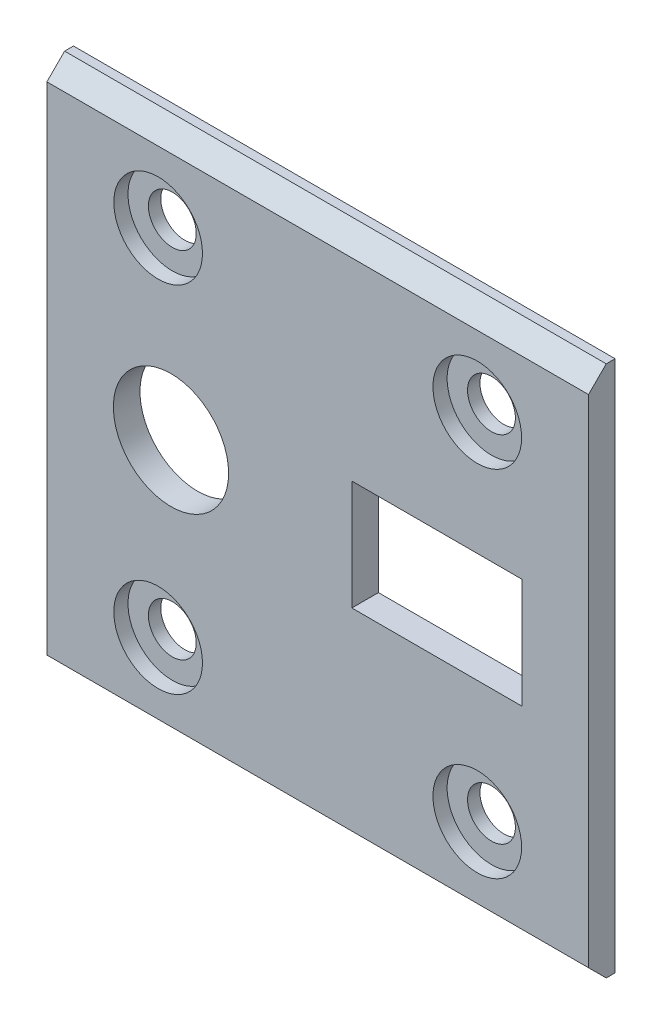
ISO-10303-21;
HEADER;
FILE_DESCRIPTION(('STEP AP214'),'2;1');
FILE_NAME('part.step','',(''),(''),'','','');
FILE_SCHEMA(('AUTOMOTIVE_DESIGN { 1 0 10303 214 1 1 1 1 }'));
ENDSEC;
DATA;
#1=APPLICATION_CONTEXT('core data for automotive mechanical design processes');
#2=APPLICATION_PROTOCOL_DEFINITION('international standard','automotive_design',2000,#1);
#3=PRODUCT_CONTEXT('',#1,'mechanical');
#4=PRODUCT('Part','Part','',(#3));
#5=PRODUCT_RELATED_PRODUCT_CATEGORY('part','',(#4));
#6=PRODUCT_DEFINITION_FORMATION('','',#4);
#7=PRODUCT_DEFINITION_CONTEXT('part definition',#1,'design');
#8=PRODUCT_DEFINITION('design','',#6,#7);
#9=PRODUCT_DEFINITION_SHAPE('','',#8);
#10=(LENGTH_UNIT() NAMED_UNIT(*) SI_UNIT(.MILLI.,.METRE.));
#11=(NAMED_UNIT(*) PLANE_ANGLE_UNIT() SI_UNIT($,.RADIAN.));
#12=(NAMED_UNIT(*) SI_UNIT($,.STERADIAN.) SOLID_ANGLE_UNIT());
#13=UNCERTAINTY_MEASURE_WITH_UNIT(LENGTH_MEASURE(1.E-05),#10,'distance_accuracy_value','');
#14=(GEOMETRIC_REPRESENTATION_CONTEXT(3) GLOBAL_UNCERTAINTY_ASSIGNED_CONTEXT((#13)) GLOBAL_UNIT_ASSIGNED_CONTEXT((#10,
#11,#12)) REPRESENTATION_CONTEXT('',''));
#15=CARTESIAN_POINT('',(0.,0.,0.));
#16=DIRECTION('',(0.,0.,1.));
#17=DIRECTION('',(1.,0.,0.));
#18=AXIS2_PLACEMENT_3D('',#15,#16,#17);
#19=CARTESIAN_POINT('',(18.,-20.,0.));
#20=DIRECTION('',(0.,0.,1.));
#21=DIRECTION('',(1.,0.,0.));
#22=AXIS2_PLACEMENT_3D('',#19,#20,#21);
#23=CYLINDRICAL_SURFACE('',#22,2.7);
#24=CARTESIAN_POINT('',(18.,-20.,0.));
#25=DIRECTION('',(0.,0.,-1.));
#26=DIRECTION('',(1.,0.,0.));
#27=AXIS2_PLACEMENT_3D('',#24,#25,#26);
#28=CIRCLE('',#27,2.7);
#29=CARTESIAN_POINT('',(20.7,-20.,0.));
#30=VERTEX_POINT('',#29);
#31=EDGE_CURVE('E214',#30,#30,#28,.T.);
#32=ORIENTED_EDGE('',*,*,#31,.T.);
#33=EDGE_LOOP('',(#32));
#34=FACE_BOUND('',#33,.T.);
#35=CARTESIAN_POINT('',(18.,-20.,1.4));
#36=DIRECTION('',(0.,0.,1.));
#37=DIRECTION('',(1.,0.,0.));
#38=AXIS2_PLACEMENT_3D('',#35,#36,#37);
#39=CIRCLE('',#38,2.7);
#40=CARTESIAN_POINT('',(20.7,-20.,1.4));
#41=VERTEX_POINT('',#40);
#42=EDGE_CURVE('E216',#41,#41,#39,.T.);
#43=ORIENTED_EDGE('',*,*,#42,.T.);
#44=EDGE_LOOP('',(#43));
#45=FACE_BOUND('',#44,.T.);
#46=ADVANCED_FACE('F33',(#34,#45),#23,.F.);
#47=CARTESIAN_POINT('',(-18.,-20.,0.));
#48=DIRECTION('',(0.,0.,1.));
#49=DIRECTION('',(1.,0.,0.));
#50=AXIS2_PLACEMENT_3D('',#47,#48,#49);
#51=CYLINDRICAL_SURFACE('',#50,2.7);
#52=CARTESIAN_POINT('',(-18.,-20.,0.));
#53=DIRECTION('',(0.,0.,-1.));
#54=DIRECTION('',(1.,0.,0.));
#55=AXIS2_PLACEMENT_3D('',#52,#53,#54);
#56=CIRCLE('',#55,2.7);
#57=CARTESIAN_POINT('',(-15.3,-20.,0.));
#58=VERTEX_POINT('',#57);
#59=EDGE_CURVE('E130',#58,#58,#56,.T.);
#60=ORIENTED_EDGE('',*,*,#59,.T.);
#61=EDGE_LOOP('',(#60));
#62=FACE_BOUND('',#61,.T.);
#63=CARTESIAN_POINT('',(-18.,-20.,1.4));
#64=DIRECTION('',(0.,0.,1.));
#65=DIRECTION('',(1.,0.,0.));
#66=AXIS2_PLACEMENT_3D('',#63,#64,#65);
#67=CIRCLE('',#66,2.7);
#68=CARTESIAN_POINT('',(-15.3,-20.,1.4));
#69=VERTEX_POINT('',#68);
#70=EDGE_CURVE('E211',#69,#69,#67,.T.);
#71=ORIENTED_EDGE('',*,*,#70,.T.);
#72=EDGE_LOOP('',(#71));
#73=FACE_BOUND('',#72,.T.);
#74=ADVANCED_FACE('F259',(#62,#73),#51,.F.);
#75=CARTESIAN_POINT('',(18.,20.,0.));
#76=DIRECTION('',(0.,0.,1.));
#77=DIRECTION('',(1.,0.,0.));
#78=AXIS2_PLACEMENT_3D('',#75,#76,#77);
#79=CYLINDRICAL_SURFACE('',#78,2.7);
#80=CARTESIAN_POINT('',(18.,20.,0.));
#81=DIRECTION('',(0.,0.,1.));
#82=DIRECTION('',(1.,0.,0.));
#83=AXIS2_PLACEMENT_3D('',#80,#81,#82);
#84=CIRCLE('',#83,2.7);
#85=CARTESIAN_POINT('',(20.7,20.,0.));
#86=VERTEX_POINT('',#85);
#87=EDGE_CURVE('E154',#86,#86,#84,.T.);
#88=ORIENTED_EDGE('',*,*,#87,.F.);
#89=EDGE_LOOP('',(#88));
#90=FACE_BOUND('',#89,.T.);
#91=CARTESIAN_POINT('',(18.,20.,1.4));
#92=DIRECTION('',(0.,0.,1.));
#93=DIRECTION('',(1.,0.,0.));
#94=AXIS2_PLACEMENT_3D('',#91,#92,#93);
#95=CIRCLE('',#94,2.7);
#96=CARTESIAN_POINT('',(20.7,20.,1.4));
#97=VERTEX_POINT('',#96);
#98=EDGE_CURVE('E144',#97,#97,#95,.F.);
#99=ORIENTED_EDGE('',*,*,#98,.F.);
#100=EDGE_LOOP('',(#99));
#101=FACE_BOUND('',#100,.T.);
#102=ADVANCED_FACE('F265',(#90,#101),#79,.F.);
#103=CARTESIAN_POINT('',(-18.,20.,0.));
#104=DIRECTION('',(0.,0.,1.));
#105=DIRECTION('',(1.,0.,0.));
#106=AXIS2_PLACEMENT_3D('',#103,#104,#105);
#107=CYLINDRICAL_SURFACE('',#106,2.7);
#108=CARTESIAN_POINT('',(-18.,20.,0.));
#109=DIRECTION('',(0.,0.,1.));
#110=DIRECTION('',(1.,0.,0.));
#111=AXIS2_PLACEMENT_3D('',#108,#109,#110);
#112=CIRCLE('',#111,2.7);
#113=CARTESIAN_POINT('',(-15.3,20.,0.));
#114=VERTEX_POINT('',#113);
#115=EDGE_CURVE('E157',#114,#114,#112,.T.);
#116=ORIENTED_EDGE('',*,*,#115,.F.);
#117=EDGE_LOOP('',(#116));
#118=FACE_BOUND('',#117,.T.);
#119=CARTESIAN_POINT('',(-18.,20.,1.4));
#120=DIRECTION('',(0.,0.,1.));
#121=DIRECTION('',(1.,0.,0.));
#122=AXIS2_PLACEMENT_3D('',#119,#120,#121);
#123=CIRCLE('',#122,2.7);
#124=CARTESIAN_POINT('',(-15.3,20.,1.4));
#125=VERTEX_POINT('',#124);
#126=EDGE_CURVE('E150',#125,#125,#123,.F.);
#127=ORIENTED_EDGE('',*,*,#126,.F.);
#128=EDGE_LOOP('',(#127));
#129=FACE_BOUND('',#128,.T.);
#130=ADVANCED_FACE('F288',(#118,#129),#107,.F.);
#131=CARTESIAN_POINT('',(0.,0.,3.));
#132=DIRECTION('',(0.,0.,1.));
#133=DIRECTION('',(1.,0.,0.));
#134=AXIS2_PLACEMENT_3D('',#131,#132,#133);
#135=PLANE('',#134);
#136=CARTESIAN_POINT('',(18.,-20.,3.));
#137=DIRECTION('',(0.,0.,-1.));
#138=DIRECTION('',(1.,0.,0.));
#139=AXIS2_PLACEMENT_3D('',#136,#137,#138);
#140=CIRCLE('',#139,5.);
#141=CARTESIAN_POINT('',(23.,-20.,3.));
#142=VERTEX_POINT('',#141);
#143=EDGE_CURVE('E355',#142,#142,#140,.T.);
#144=ORIENTED_EDGE('',*,*,#143,.T.);
#145=EDGE_LOOP('',(#144));
#146=FACE_BOUND('',#145,.T.);
#147=CARTESIAN_POINT('',(-18.,-20.,3.));
#148=DIRECTION('',(0.,0.,-1.));
#149=DIRECTION('',(1.,0.,0.));
#150=AXIS2_PLACEMENT_3D('',#147,#148,#149);
#151=CIRCLE('',#150,5.);
#152=CARTESIAN_POINT('',(-13.,-20.,3.));
#153=VERTEX_POINT('',#152);
#154=EDGE_CURVE('E219',#153,#153,#151,.T.);
#155=ORIENTED_EDGE('',*,*,#154,.T.);
#156=EDGE_LOOP('',(#155));
#157=FACE_BOUND('',#156,.T.);
#158=CARTESIAN_POINT('',(18.,20.,3.));
#159=DIRECTION('',(0.,0.,1.));
#160=DIRECTION('',(1.,0.,0.));
#161=AXIS2_PLACEMENT_3D('',#158,#159,#160);
#162=CIRCLE('',#161,5.);
#163=CARTESIAN_POINT('',(23.,20.,3.));
#164=VERTEX_POINT('',#163);
#165=EDGE_CURVE('E138',#164,#164,#162,.T.);
#166=ORIENTED_EDGE('',*,*,#165,.F.);
#167=EDGE_LOOP('',(#166));
#168=FACE_BOUND('',#167,.T.);
#169=CARTESIAN_POINT('',(-18.,20.,3.));
#170=DIRECTION('',(0.,0.,1.));
#171=DIRECTION('',(1.,0.,0.));
#172=AXIS2_PLACEMENT_3D('',#169,#170,#171);
#173=CIRCLE('',#172,5.);
#174=CARTESIAN_POINT('',(-13.,20.,3.));
#175=VERTEX_POINT('',#174);
#176=EDGE_CURVE('E151',#175,#175,#173,.T.);
#177=ORIENTED_EDGE('',*,*,#176,.F.);
#178=EDGE_LOOP('',(#177));
#179=FACE_BOUND('',#178,.T.);
#180=DIRECTION('',(0.,-1.,0.));
#181=VECTOR('',#180,1.);
#182=CARTESIAN_POINT('',(-30.55,10.,3.));
#183=LINE('',#182,#181);
#184=CARTESIAN_POINT('',(-30.55,28.,3.));
#185=VERTEX_POINT('',#184);
#186=CARTESIAN_POINT('',(-30.55,-28.,3.));
#187=VERTEX_POINT('',#186);
#188=EDGE_CURVE('E203',#185,#187,#183,.T.);
#189=ORIENTED_EDGE('',*,*,#188,.T.);
#190=DIRECTION('',(1.,0.,0.));
#191=VECTOR('',#190,1.);
#192=CARTESIAN_POINT('',(30.55,-28.,3.));
#193=LINE('',#192,#191);
#194=CARTESIAN_POINT('',(30.55,-28.,3.));
#195=VERTEX_POINT('',#194);
#196=EDGE_CURVE('E229',#187,#195,#193,.T.);
#197=ORIENTED_EDGE('',*,*,#196,.T.);
#198=DIRECTION('',(0.,1.,0.));
#199=VECTOR('',#198,1.);
#200=CARTESIAN_POINT('',(30.55,10.,3.));
#201=LINE('',#200,#199);
#202=CARTESIAN_POINT('',(30.55,28.,3.));
#203=VERTEX_POINT('',#202);
#204=EDGE_CURVE('E120',#195,#203,#201,.T.);
#205=ORIENTED_EDGE('',*,*,#204,.T.);
#206=DIRECTION('',(-1.,0.,0.));
#207=VECTOR('',#206,1.);
#208=CARTESIAN_POINT('',(0.,28.,3.));
#209=LINE('',#208,#207);
#210=EDGE_CURVE('E226',#203,#185,#209,.T.);
#211=ORIENTED_EDGE('',*,*,#210,.T.);
#212=EDGE_LOOP('',(#189,#197,#205,#211));
#213=FACE_BOUND('',#212,.T.);
#214=CARTESIAN_POINT('',(-16.55,0.,3.));
#215=DIRECTION('',(0.,0.,1.));
#216=DIRECTION('',(1.,0.,0.));
#217=AXIS2_PLACEMENT_3D('',#214,#215,#216);
#218=CIRCLE('',#217,6.5);
#219=CARTESIAN_POINT('',(-10.05,0.,3.));
#220=VERTEX_POINT('',#219);
#221=EDGE_CURVE('E197',#220,#220,#218,.T.);
#222=ORIENTED_EDGE('',*,*,#221,.F.);
#223=EDGE_LOOP('',(#222));
#224=FACE_BOUND('',#223,.T.);
#225=DIRECTION('',(-1.,0.,0.));
#226=VECTOR('',#225,1.);
#227=CARTESIAN_POINT('',(3.85000000000001,6.2,3.));
#228=LINE('',#227,#226);
#229=CARTESIAN_POINT('',(23.05,6.2,3.));
#230=VERTEX_POINT('',#229);
#231=CARTESIAN_POINT('',(3.85000000000001,6.2,3.));
#232=VERTEX_POINT('',#231);
#233=EDGE_CURVE('E168',#230,#232,#228,.T.);
#234=ORIENTED_EDGE('',*,*,#233,.F.);
#235=DIRECTION('',(0.,1.,0.));
#236=VECTOR('',#235,1.);
#237=CARTESIAN_POINT('',(23.05,6.2,3.));
#238=LINE('',#237,#236);
#239=CARTESIAN_POINT('',(23.05,-6.2,3.));
#240=VERTEX_POINT('',#239);
#241=EDGE_CURVE('E166',#240,#230,#238,.T.);
#242=ORIENTED_EDGE('',*,*,#241,.F.);
#243=DIRECTION('',(1.,0.,0.));
#244=VECTOR('',#243,1.);
#245=CARTESIAN_POINT('',(3.85000000000001,-6.2,3.));
#246=LINE('',#245,#244);
#247=CARTESIAN_POINT('',(3.85000000000001,-6.2,3.));
#248=VERTEX_POINT('',#247);
#249=EDGE_CURVE('E174',#248,#240,#246,.T.);
#250=ORIENTED_EDGE('',*,*,#249,.F.);
#251=DIRECTION('',(0.,-1.,0.));
#252=VECTOR('',#251,1.);
#253=CARTESIAN_POINT('',(3.85000000000001,6.2,3.));
#254=LINE('',#253,#252);
#255=EDGE_CURVE('E171',#232,#248,#254,.T.);
#256=ORIENTED_EDGE('',*,*,#255,.F.);
#257=EDGE_LOOP('',(#234,#242,#250,#256));
#258=FACE_BOUND('',#257,.T.);
#259=ADVANCED_FACE('F238',(#146,#157,#168,#179,#213,#224,#258),#135,.T.);
#260=CARTESIAN_POINT('',(0.,0.,0.));
#261=DIRECTION('',(0.,0.,1.));
#262=DIRECTION('',(1.,0.,0.));
#263=AXIS2_PLACEMENT_3D('',#260,#261,#262);
#264=PLANE('',#263);
#265=ORIENTED_EDGE('',*,*,#31,.F.);
#266=EDGE_LOOP('',(#265));
#267=FACE_BOUND('',#266,.T.);
#268=ORIENTED_EDGE('',*,*,#59,.F.);
#269=EDGE_LOOP('',(#268));
#270=FACE_BOUND('',#269,.T.);
#271=ORIENTED_EDGE('',*,*,#87,.T.);
#272=EDGE_LOOP('',(#271));
#273=FACE_BOUND('',#272,.T.);
#274=ORIENTED_EDGE('',*,*,#115,.T.);
#275=EDGE_LOOP('',(#274));
#276=FACE_BOUND('',#275,.T.);
#277=CARTESIAN_POINT('',(-16.55,0.,0.));
#278=DIRECTION('',(0.,0.,1.));
#279=DIRECTION('',(1.,0.,0.));
#280=AXIS2_PLACEMENT_3D('',#277,#278,#279);
#281=CIRCLE('',#280,6.5);
#282=CARTESIAN_POINT('',(-10.05,0.,0.));
#283=VERTEX_POINT('',#282);
#284=EDGE_CURVE('E196',#283,#283,#281,.T.);
#285=ORIENTED_EDGE('',*,*,#284,.T.);
#286=EDGE_LOOP('',(#285));
#287=FACE_BOUND('',#286,.T.);
#288=DIRECTION('',(0.,1.,0.));
#289=VECTOR('',#288,1.);
#290=CARTESIAN_POINT('',(30.55,10.,0.));
#291=LINE('',#290,#289);
#292=CARTESIAN_POINT('',(30.55,-30.,0.));
#293=VERTEX_POINT('',#292);
#294=CARTESIAN_POINT('',(30.55,30.,0.));
#295=VERTEX_POINT('',#294);
#296=EDGE_CURVE('E121',#293,#295,#291,.T.);
#297=ORIENTED_EDGE('',*,*,#296,.F.);
#298=DIRECTION('',(-1.,0.,0.));
#299=VECTOR('',#298,1.);
#300=CARTESIAN_POINT('',(30.55,-30.,0.));
#301=LINE('',#300,#299);
#302=CARTESIAN_POINT('',(-30.55,-30.,0.));
#303=VERTEX_POINT('',#302);
#304=EDGE_CURVE('E124',#293,#303,#301,.T.);
#305=ORIENTED_EDGE('',*,*,#304,.T.);
#306=DIRECTION('',(0.,-1.,0.));
#307=VECTOR('',#306,1.);
#308=CARTESIAN_POINT('',(-30.55,10.,0.));
#309=LINE('',#308,#307);
#310=CARTESIAN_POINT('',(-30.55,30.,0.));
#311=VERTEX_POINT('',#310);
#312=EDGE_CURVE('E111',#311,#303,#309,.T.);
#313=ORIENTED_EDGE('',*,*,#312,.F.);
#314=DIRECTION('',(-1.,0.,0.));
#315=VECTOR('',#314,1.);
#316=CARTESIAN_POINT('',(30.55,30.,0.));
#317=LINE('',#316,#315);
#318=EDGE_CURVE('E160',#295,#311,#317,.T.);
#319=ORIENTED_EDGE('',*,*,#318,.F.);
#320=EDGE_LOOP('',(#297,#305,#313,#319));
#321=FACE_BOUND('',#320,.T.);
#322=DIRECTION('',(0.,1.,0.));
#323=VECTOR('',#322,1.);
#324=CARTESIAN_POINT('',(23.05,6.2,0.));
#325=LINE('',#324,#323);
#326=CARTESIAN_POINT('',(23.05,-6.2,0.));
#327=VERTEX_POINT('',#326);
#328=CARTESIAN_POINT('',(23.05,6.2,0.));
#329=VERTEX_POINT('',#328);
#330=EDGE_CURVE('E164',#327,#329,#325,.T.);
#331=ORIENTED_EDGE('',*,*,#330,.T.);
#332=DIRECTION('',(-1.,0.,0.));
#333=VECTOR('',#332,1.);
#334=CARTESIAN_POINT('',(3.85000000000001,6.2,0.));
#335=LINE('',#334,#333);
#336=CARTESIAN_POINT('',(3.85000000000001,6.2,0.));
#337=VERTEX_POINT('',#336);
#338=EDGE_CURVE('E179',#329,#337,#335,.T.);
#339=ORIENTED_EDGE('',*,*,#338,.T.);
#340=DIRECTION('',(0.,-1.,0.));
#341=VECTOR('',#340,1.);
#342=CARTESIAN_POINT('',(3.85000000000001,6.2,0.));
#343=LINE('',#342,#341);
#344=CARTESIAN_POINT('',(3.85000000000001,-6.2,0.));
#345=VERTEX_POINT('',#344);
#346=EDGE_CURVE('E182',#337,#345,#343,.T.);
#347=ORIENTED_EDGE('',*,*,#346,.T.);
#348=DIRECTION('',(1.,0.,0.));
#349=VECTOR('',#348,1.);
#350=CARTESIAN_POINT('',(3.85000000000001,-6.2,0.));
#351=LINE('',#350,#349);
#352=EDGE_CURVE('E169',#345,#327,#351,.T.);
#353=ORIENTED_EDGE('',*,*,#352,.T.);
#354=EDGE_LOOP('',(#331,#339,#347,#353));
#355=FACE_BOUND('',#354,.T.);
#356=ADVANCED_FACE('F125',(#267,#270,#273,#276,#287,#321,#355),#264,.F.);
#357=CARTESIAN_POINT('',(30.55,10.,3.));
#358=DIRECTION('',(-1.,0.,0.));
#359=DIRECTION('',(0.,0.,1.));
#360=AXIS2_PLACEMENT_3D('',#357,#358,#359);
#361=PLANE('',#360);
#362=ORIENTED_EDGE('',*,*,#204,.F.);
#363=DIRECTION('',(0.,-0.707106781186546,-0.707106781186549));
#364=VECTOR('',#363,1.);
#365=CARTESIAN_POINT('',(30.55,-30.,0.999999999999984));
#366=LINE('',#365,#364);
#367=CARTESIAN_POINT('',(30.55,-30.,0.999999999999984));
#368=VERTEX_POINT('',#367);
#369=EDGE_CURVE('E41',#195,#368,#366,.T.);
#370=ORIENTED_EDGE('',*,*,#369,.T.);
#371=DIRECTION('',(0.,0.,1.));
#372=VECTOR('',#371,1.);
#373=CARTESIAN_POINT('',(30.55,-30.,0.));
#374=LINE('',#373,#372);
#375=EDGE_CURVE('E136',#293,#368,#374,.T.);
#376=ORIENTED_EDGE('',*,*,#375,.F.);
#377=ORIENTED_EDGE('',*,*,#296,.T.);
#378=DIRECTION('',(0.,0.,1.));
#379=VECTOR('',#378,1.);
#380=CARTESIAN_POINT('',(30.55,30.,0.));
#381=LINE('',#380,#379);
#382=CARTESIAN_POINT('',(30.55,30.,0.999999999999998));
#383=VERTEX_POINT('',#382);
#384=EDGE_CURVE('E162',#295,#383,#381,.T.);
#385=ORIENTED_EDGE('',*,*,#384,.T.);
#386=DIRECTION('',(0.,0.707106781186548,-0.707106781186548));
#387=VECTOR('',#386,1.);
#388=CARTESIAN_POINT('',(30.55,28.,3.));
#389=LINE('',#388,#387);
#390=EDGE_CURVE('E53',#383,#203,#389,.F.);
#391=ORIENTED_EDGE('',*,*,#390,.T.);
#392=EDGE_LOOP('',(#362,#370,#376,#377,#385,#391));
#393=FACE_BOUND('',#392,.T.);
#394=ADVANCED_FACE('F232',(#393),#361,.F.);
#395=CARTESIAN_POINT('',(-30.55,10.,3.));
#396=DIRECTION('',(1.,0.,0.));
#397=DIRECTION('',(0.,0.,-1.));
#398=AXIS2_PLACEMENT_3D('',#395,#396,#397);
#399=PLANE('',#398);
#400=DIRECTION('',(0.,0.,1.));
#401=VECTOR('',#400,1.);
#402=CARTESIAN_POINT('',(-30.55,-30.,0.));
#403=LINE('',#402,#401);
#404=CARTESIAN_POINT('',(-30.55,-30.,0.999999999999984));
#405=VERTEX_POINT('',#404);
#406=EDGE_CURVE('E115',#303,#405,#403,.T.);
#407=ORIENTED_EDGE('',*,*,#406,.T.);
#408=DIRECTION('',(0.,0.707106781186546,0.707106781186549));
#409=VECTOR('',#408,1.);
#410=CARTESIAN_POINT('',(-30.55,-30.,0.999999999999981));
#411=LINE('',#410,#409);
#412=EDGE_CURVE('E224',#405,#187,#411,.T.);
#413=ORIENTED_EDGE('',*,*,#412,.T.);
#414=ORIENTED_EDGE('',*,*,#188,.F.);
#415=DIRECTION('',(0.,-0.707106781186548,0.707106781186548));
#416=VECTOR('',#415,1.);
#417=CARTESIAN_POINT('',(-30.55,28.,3.));
#418=LINE('',#417,#416);
#419=CARTESIAN_POINT('',(-30.55,30.,0.999999999999998));
#420=VERTEX_POINT('',#419);
#421=EDGE_CURVE('E222',#185,#420,#418,.F.);
#422=ORIENTED_EDGE('',*,*,#421,.T.);
#423=DIRECTION('',(0.,0.,1.));
#424=VECTOR('',#423,1.);
#425=CARTESIAN_POINT('',(-30.55,30.,0.));
#426=LINE('',#425,#424);
#427=EDGE_CURVE('E116',#311,#420,#426,.T.);
#428=ORIENTED_EDGE('',*,*,#427,.F.);
#429=ORIENTED_EDGE('',*,*,#312,.T.);
#430=EDGE_LOOP('',(#407,#413,#414,#422,#428,#429));
#431=FACE_BOUND('',#430,.T.);
#432=ADVANCED_FACE('F113',(#431),#399,.F.);
#433=CARTESIAN_POINT('',(-16.55,0.,3.));
#434=DIRECTION('',(0.,0.,-1.));
#435=DIRECTION('',(-1.,0.,0.));
#436=AXIS2_PLACEMENT_3D('',#433,#434,#435);
#437=CYLINDRICAL_SURFACE('',#436,6.5);
#438=ORIENTED_EDGE('',*,*,#221,.T.);
#439=EDGE_LOOP('',(#438));
#440=FACE_BOUND('',#439,.T.);
#441=ORIENTED_EDGE('',*,*,#284,.F.);
#442=EDGE_LOOP('',(#441));
#443=FACE_BOUND('',#442,.T.);
#444=ADVANCED_FACE('F308',(#440,#443),#437,.F.);
#445=CARTESIAN_POINT('',(23.05,6.2,3.));
#446=DIRECTION('',(-1.,0.,0.));
#447=DIRECTION('',(0.,0.,1.));
#448=AXIS2_PLACEMENT_3D('',#445,#446,#447);
#449=PLANE('',#448);
#450=ORIENTED_EDGE('',*,*,#330,.F.);
#451=DIRECTION('',(0.,0.,-1.));
#452=VECTOR('',#451,1.);
#453=CARTESIAN_POINT('',(23.05,-6.2,3.));
#454=LINE('',#453,#452);
#455=EDGE_CURVE('E176',#240,#327,#454,.T.);
#456=ORIENTED_EDGE('',*,*,#455,.F.);
#457=ORIENTED_EDGE('',*,*,#241,.T.);
#458=DIRECTION('',(0.,0.,-1.));
#459=VECTOR('',#458,1.);
#460=CARTESIAN_POINT('',(23.05,6.2,3.));
#461=LINE('',#460,#459);
#462=EDGE_CURVE('E193',#230,#329,#461,.T.);
#463=ORIENTED_EDGE('',*,*,#462,.T.);
#464=EDGE_LOOP('',(#450,#456,#457,#463));
#465=FACE_BOUND('',#464,.T.);
#466=ADVANCED_FACE('F310',(#465),#449,.T.);
#467=CARTESIAN_POINT('',(3.85000000000001,6.2,3.));
#468=DIRECTION('',(0.,-1.,0.));
#469=DIRECTION('',(0.,0.,-1.));
#470=AXIS2_PLACEMENT_3D('',#467,#468,#469);
#471=PLANE('',#470);
#472=ORIENTED_EDGE('',*,*,#338,.F.);
#473=ORIENTED_EDGE('',*,*,#462,.F.);
#474=ORIENTED_EDGE('',*,*,#233,.T.);
#475=DIRECTION('',(0.,0.,-1.));
#476=VECTOR('',#475,1.);
#477=CARTESIAN_POINT('',(3.85000000000001,6.2,3.));
#478=LINE('',#477,#476);
#479=EDGE_CURVE('E191',#232,#337,#478,.T.);
#480=ORIENTED_EDGE('',*,*,#479,.T.);
#481=EDGE_LOOP('',(#472,#473,#474,#480));
#482=FACE_BOUND('',#481,.T.);
#483=ADVANCED_FACE('F317',(#482),#471,.T.);
#484=CARTESIAN_POINT('',(3.85000000000001,6.2,3.));
#485=DIRECTION('',(1.,0.,0.));
#486=DIRECTION('',(0.,1.,0.));
#487=AXIS2_PLACEMENT_3D('',#484,#485,#486);
#488=PLANE('',#487);
#489=ORIENTED_EDGE('',*,*,#346,.F.);
#490=ORIENTED_EDGE('',*,*,#479,.F.);
#491=ORIENTED_EDGE('',*,*,#255,.T.);
#492=DIRECTION('',(0.,0.,-1.));
#493=VECTOR('',#492,1.);
#494=CARTESIAN_POINT('',(3.85000000000001,-6.2,3.));
#495=LINE('',#494,#493);
#496=EDGE_CURVE('E189',#248,#345,#495,.T.);
#497=ORIENTED_EDGE('',*,*,#496,.T.);
#498=EDGE_LOOP('',(#489,#490,#491,#497));
#499=FACE_BOUND('',#498,.T.);
#500=ADVANCED_FACE('F254',(#499),#488,.T.);
#501=CARTESIAN_POINT('',(3.85000000000001,-6.2,3.));
#502=DIRECTION('',(0.,1.,0.));
#503=DIRECTION('',(-1.,0.,0.));
#504=AXIS2_PLACEMENT_3D('',#501,#502,#503);
#505=PLANE('',#504);
#506=ORIENTED_EDGE('',*,*,#352,.F.);
#507=ORIENTED_EDGE('',*,*,#496,.F.);
#508=ORIENTED_EDGE('',*,*,#249,.T.);
#509=ORIENTED_EDGE('',*,*,#455,.T.);
#510=EDGE_LOOP('',(#506,#507,#508,#509));
#511=FACE_BOUND('',#510,.T.);
#512=ADVANCED_FACE('F245',(#511),#505,.T.);
#513=CARTESIAN_POINT('',(30.55,30.,0.));
#514=DIRECTION('',(0.,1.,0.));
#515=DIRECTION('',(-1.,0.,0.));
#516=AXIS2_PLACEMENT_3D('',#513,#514,#515);
#517=PLANE('',#516);
#518=ORIENTED_EDGE('',*,*,#427,.T.);
#519=DIRECTION('',(1.,0.,0.));
#520=VECTOR('',#519,1.);
#521=CARTESIAN_POINT('',(30.55,30.,0.999999999999998));
#522=LINE('',#521,#520);
#523=EDGE_CURVE('E11',#420,#383,#522,.T.);
#524=ORIENTED_EDGE('',*,*,#523,.T.);
#525=ORIENTED_EDGE('',*,*,#384,.F.);
#526=ORIENTED_EDGE('',*,*,#318,.T.);
#527=EDGE_LOOP('',(#518,#524,#525,#526));
#528=FACE_BOUND('',#527,.T.);
#529=ADVANCED_FACE('F242',(#528),#517,.T.);
#530=CARTESIAN_POINT('',(-18.,20.,1.4));
#531=DIRECTION('',(0.,0.,1.));
#532=DIRECTION('',(1.,0.,0.));
#533=AXIS2_PLACEMENT_3D('',#530,#531,#532);
#534=PLANE('',#533);
#535=CARTESIAN_POINT('',(-18.,20.,1.4));
#536=DIRECTION('',(0.,0.,1.));
#537=DIRECTION('',(1.,0.,0.));
#538=AXIS2_PLACEMENT_3D('',#535,#536,#537);
#539=CIRCLE('',#538,5.);
#540=CARTESIAN_POINT('',(-13.,20.,1.4));
#541=VERTEX_POINT('',#540);
#542=EDGE_CURVE('E147',#541,#541,#539,.T.);
#543=ORIENTED_EDGE('',*,*,#542,.T.);
#544=EDGE_LOOP('',(#543));
#545=FACE_BOUND('',#544,.T.);
#546=ORIENTED_EDGE('',*,*,#126,.T.);
#547=EDGE_LOOP('',(#546));
#548=FACE_BOUND('',#547,.T.);
#549=ADVANCED_FACE('F244',(#545,#548),#534,.T.);
#550=CARTESIAN_POINT('',(-18.,20.,1.4));
#551=DIRECTION('',(0.,0.,1.));
#552=DIRECTION('',(1.,0.,0.));
#553=AXIS2_PLACEMENT_3D('',#550,#551,#552);
#554=CYLINDRICAL_SURFACE('',#553,5.);
#555=ORIENTED_EDGE('',*,*,#542,.F.);
#556=EDGE_LOOP('',(#555));
#557=FACE_BOUND('',#556,.T.);
#558=ORIENTED_EDGE('',*,*,#176,.T.);
#559=EDGE_LOOP('',(#558));
#560=FACE_BOUND('',#559,.T.);
#561=ADVANCED_FACE('F251',(#557,#560),#554,.F.);
#562=CARTESIAN_POINT('',(18.,20.,1.4));
#563=DIRECTION('',(0.,0.,1.));
#564=DIRECTION('',(1.,0.,0.));
#565=AXIS2_PLACEMENT_3D('',#562,#563,#564);
#566=PLANE('',#565);
#567=CARTESIAN_POINT('',(18.,20.,1.4));
#568=DIRECTION('',(0.,0.,1.));
#569=DIRECTION('',(1.,0.,0.));
#570=AXIS2_PLACEMENT_3D('',#567,#568,#569);
#571=CIRCLE('',#570,5.);
#572=CARTESIAN_POINT('',(23.,20.,1.4));
#573=VERTEX_POINT('',#572);
#574=EDGE_CURVE('E141',#573,#573,#571,.T.);
#575=ORIENTED_EDGE('',*,*,#574,.T.);
#576=EDGE_LOOP('',(#575));
#577=FACE_BOUND('',#576,.T.);
#578=ORIENTED_EDGE('',*,*,#98,.T.);
#579=EDGE_LOOP('',(#578));
#580=FACE_BOUND('',#579,.T.);
#581=ADVANCED_FACE('F277',(#577,#580),#566,.T.);
#582=CARTESIAN_POINT('',(18.,20.,1.4));
#583=DIRECTION('',(0.,0.,1.));
#584=DIRECTION('',(1.,0.,0.));
#585=AXIS2_PLACEMENT_3D('',#582,#583,#584);
#586=CYLINDRICAL_SURFACE('',#585,5.);
#587=ORIENTED_EDGE('',*,*,#574,.F.);
#588=EDGE_LOOP('',(#587));
#589=FACE_BOUND('',#588,.T.);
#590=ORIENTED_EDGE('',*,*,#165,.T.);
#591=EDGE_LOOP('',(#590));
#592=FACE_BOUND('',#591,.T.);
#593=ADVANCED_FACE('F276',(#589,#592),#586,.F.);
#594=CARTESIAN_POINT('',(30.55,-30.,0.));
#595=DIRECTION('',(0.,1.,0.));
#596=DIRECTION('',(-1.,0.,0.));
#597=AXIS2_PLACEMENT_3D('',#594,#595,#596);
#598=PLANE('',#597);
#599=ORIENTED_EDGE('',*,*,#375,.T.);
#600=DIRECTION('',(-1.,0.,0.));
#601=VECTOR('',#600,1.);
#602=CARTESIAN_POINT('',(-30.55,-30.,0.999999999999984));
#603=LINE('',#602,#601);
#604=EDGE_CURVE('E135',#368,#405,#603,.T.);
#605=ORIENTED_EDGE('',*,*,#604,.T.);
#606=ORIENTED_EDGE('',*,*,#406,.F.);
#607=ORIENTED_EDGE('',*,*,#304,.F.);
#608=EDGE_LOOP('',(#599,#605,#606,#607));
#609=FACE_BOUND('',#608,.T.);
#610=ADVANCED_FACE('F133',(#609),#598,.F.);
#611=CARTESIAN_POINT('',(-18.,-20.,1.4));
#612=DIRECTION('',(0.,0.,1.));
#613=DIRECTION('',(1.,0.,0.));
#614=AXIS2_PLACEMENT_3D('',#611,#612,#613);
#615=CYLINDRICAL_SURFACE('',#614,5.);
#616=CARTESIAN_POINT('',(-18.,-20.,1.4));
#617=DIRECTION('',(0.,0.,-1.));
#618=DIRECTION('',(1.,0.,0.));
#619=AXIS2_PLACEMENT_3D('',#616,#617,#618);
#620=CIRCLE('',#619,5.);
#621=CARTESIAN_POINT('',(-13.,-20.,1.4));
#622=VERTEX_POINT('',#621);
#623=EDGE_CURVE('E215',#622,#622,#620,.T.);
#624=ORIENTED_EDGE('',*,*,#623,.T.);
#625=EDGE_LOOP('',(#624));
#626=FACE_BOUND('',#625,.T.);
#627=ORIENTED_EDGE('',*,*,#154,.F.);
#628=EDGE_LOOP('',(#627));
#629=FACE_BOUND('',#628,.T.);
#630=ADVANCED_FACE('F271',(#626,#629),#615,.F.);
#631=CARTESIAN_POINT('',(-18.,-20.,1.4));
#632=DIRECTION('',(0.,0.,1.));
#633=DIRECTION('',(1.,0.,0.));
#634=AXIS2_PLACEMENT_3D('',#631,#632,#633);
#635=PLANE('',#634);
#636=ORIENTED_EDGE('',*,*,#70,.F.);
#637=EDGE_LOOP('',(#636));
#638=FACE_BOUND('',#637,.T.);
#639=ORIENTED_EDGE('',*,*,#623,.F.);
#640=EDGE_LOOP('',(#639));
#641=FACE_BOUND('',#640,.T.);
#642=ADVANCED_FACE('F336',(#638,#641),#635,.T.);
#643=CARTESIAN_POINT('',(18.,-20.,1.4));
#644=DIRECTION('',(0.,0.,1.));
#645=DIRECTION('',(1.,0.,0.));
#646=AXIS2_PLACEMENT_3D('',#643,#644,#645);
#647=CYLINDRICAL_SURFACE('',#646,5.);
#648=CARTESIAN_POINT('',(18.,-20.,1.4));
#649=DIRECTION('',(0.,0.,-1.));
#650=DIRECTION('',(1.,0.,0.));
#651=AXIS2_PLACEMENT_3D('',#648,#649,#650);
#652=CIRCLE('',#651,5.);
#653=CARTESIAN_POINT('',(23.,-20.,1.4));
#654=VERTEX_POINT('',#653);
#655=EDGE_CURVE('E220',#654,#654,#652,.T.);
#656=ORIENTED_EDGE('',*,*,#655,.T.);
#657=EDGE_LOOP('',(#656));
#658=FACE_BOUND('',#657,.T.);
#659=ORIENTED_EDGE('',*,*,#143,.F.);
#660=EDGE_LOOP('',(#659));
#661=FACE_BOUND('',#660,.T.);
#662=ADVANCED_FACE('F330',(#658,#661),#647,.F.);
#663=CARTESIAN_POINT('',(18.,-20.,1.4));
#664=DIRECTION('',(0.,0.,1.));
#665=DIRECTION('',(1.,0.,0.));
#666=AXIS2_PLACEMENT_3D('',#663,#664,#665);
#667=PLANE('',#666);
#668=ORIENTED_EDGE('',*,*,#42,.F.);
#669=EDGE_LOOP('',(#668));
#670=FACE_BOUND('',#669,.T.);
#671=ORIENTED_EDGE('',*,*,#655,.F.);
#672=EDGE_LOOP('',(#671));
#673=FACE_BOUND('',#672,.T.);
#674=ADVANCED_FACE('F325',(#670,#673),#667,.T.);
#675=CARTESIAN_POINT('',(30.55,-30.,0.999999999999984));
#676=DIRECTION('',(0.,-0.707106781186549,0.707106781186546));
#677=DIRECTION('',(1.,0.,0.));
#678=AXIS2_PLACEMENT_3D('',#675,#676,#677);
#679=PLANE('',#678);
#680=ORIENTED_EDGE('',*,*,#369,.F.);
#681=ORIENTED_EDGE('',*,*,#196,.F.);
#682=ORIENTED_EDGE('',*,*,#412,.F.);
#683=ORIENTED_EDGE('',*,*,#604,.F.);
#684=EDGE_LOOP('',(#680,#681,#682,#683));
#685=FACE_BOUND('',#684,.T.);
#686=ADVANCED_FACE('F235',(#685),#679,.T.);
#687=CARTESIAN_POINT('',(0.,28.,3.));
#688=DIRECTION('',(0.,-0.707106781186547,-0.707106781186547));
#689=DIRECTION('',(-1.,0.,0.));
#690=AXIS2_PLACEMENT_3D('',#687,#688,#689);
#691=PLANE('',#690);
#692=ORIENTED_EDGE('',*,*,#390,.F.);
#693=ORIENTED_EDGE('',*,*,#523,.F.);
#694=ORIENTED_EDGE('',*,*,#421,.F.);
#695=ORIENTED_EDGE('',*,*,#210,.F.);
#696=EDGE_LOOP('',(#692,#693,#694,#695));
#697=FACE_BOUND('',#696,.T.);
#698=ADVANCED_FACE('F35',(#697),#691,.F.);
#699=CLOSED_SHELL('',(#46,#74,#102,#130,#259,#356,#394,#432,#444,#466,#483,#500,#512,#529,#549,
#561,#581,#593,#610,#630,#642,#662,#674,#686,#698));
#700=MANIFOLD_SOLID_BREP('B2',#699);
#701=ADVANCED_BREP_SHAPE_REPRESENTATION('',(#18,#700),#14);
#702=SHAPE_DEFINITION_REPRESENTATION(#9,#701);
ENDSEC;
END-ISO-10303-21;
